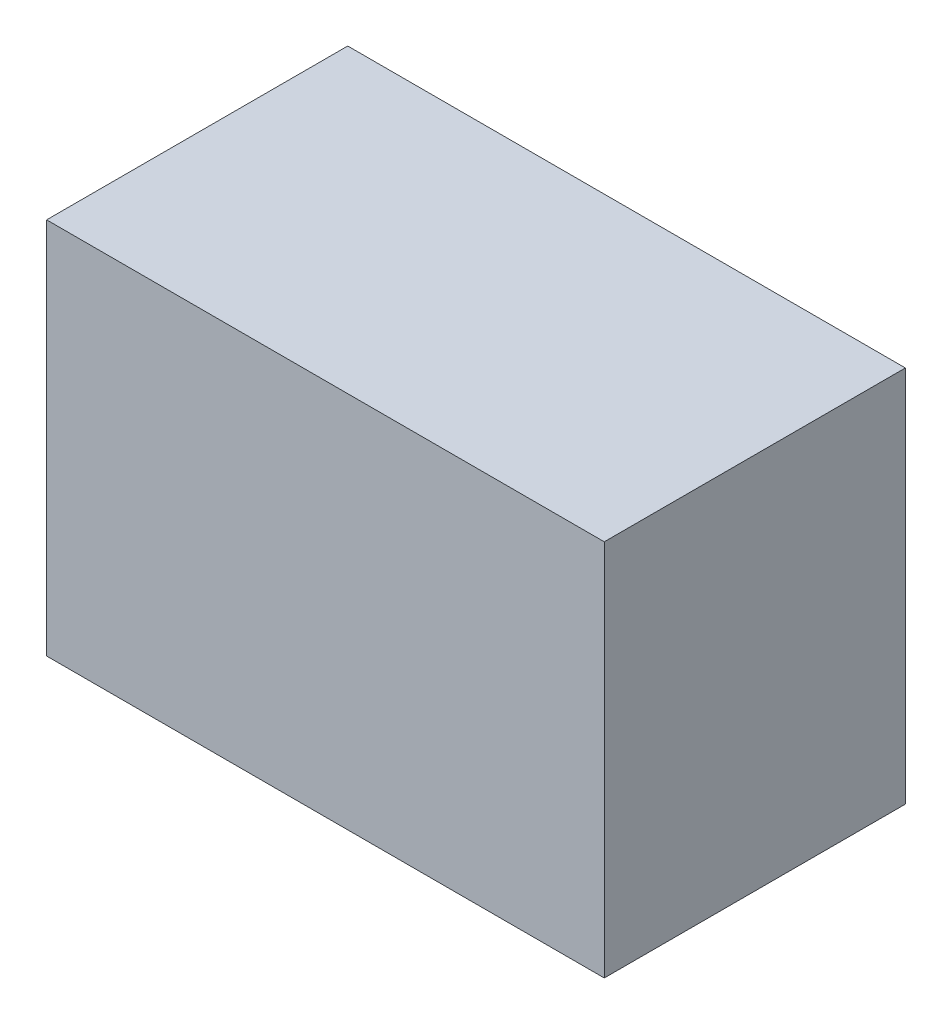
ISO-10303-21;
HEADER;
FILE_DESCRIPTION(('STEP AP214'),'2;1');
FILE_NAME('part.step','',(''),(''),'','','');
FILE_SCHEMA(('AUTOMOTIVE_DESIGN { 1 0 10303 214 1 1 1 1 }'));
ENDSEC;
DATA;
#1=APPLICATION_CONTEXT('core data for automotive mechanical design processes');
#2=APPLICATION_PROTOCOL_DEFINITION('international standard','automotive_design',2000,#1);
#3=PRODUCT_CONTEXT('',#1,'mechanical');
#4=PRODUCT('Part','Part','',(#3));
#5=PRODUCT_RELATED_PRODUCT_CATEGORY('part','',(#4));
#6=PRODUCT_DEFINITION_FORMATION('','',#4);
#7=PRODUCT_DEFINITION_CONTEXT('part definition',#1,'design');
#8=PRODUCT_DEFINITION('design','',#6,#7);
#9=PRODUCT_DEFINITION_SHAPE('','',#8);
#10=(LENGTH_UNIT() NAMED_UNIT(*) SI_UNIT(.MILLI.,.METRE.));
#11=(NAMED_UNIT(*) PLANE_ANGLE_UNIT() SI_UNIT($,.RADIAN.));
#12=(NAMED_UNIT(*) SI_UNIT($,.STERADIAN.) SOLID_ANGLE_UNIT());
#13=UNCERTAINTY_MEASURE_WITH_UNIT(LENGTH_MEASURE(1.E-05),#10,'distance_accuracy_value','');
#14=(GEOMETRIC_REPRESENTATION_CONTEXT(3) GLOBAL_UNCERTAINTY_ASSIGNED_CONTEXT((#13)) GLOBAL_UNIT_ASSIGNED_CONTEXT((#10,
#11,#12)) REPRESENTATION_CONTEXT('',''));
#15=CARTESIAN_POINT('',(0.,0.,0.));
#16=DIRECTION('',(0.,0.,1.));
#17=DIRECTION('',(1.,0.,0.));
#18=AXIS2_PLACEMENT_3D('',#15,#16,#17);
#19=CARTESIAN_POINT('',(46.3,-31.365,50.));
#20=DIRECTION('',(-1.,0.,0.));
#21=DIRECTION('',(0.,0.,1.));
#22=AXIS2_PLACEMENT_3D('',#19,#20,#21);
#23=PLANE('',#22);
#24=DIRECTION('',(0.,1.,0.));
#25=VECTOR('',#24,1.);
#26=CARTESIAN_POINT('',(46.3,-31.365,0.));
#27=LINE('',#26,#25);
#28=CARTESIAN_POINT('',(46.3,-31.365,0.));
#29=VERTEX_POINT('',#28);
#30=CARTESIAN_POINT('',(46.3,31.365,0.));
#31=VERTEX_POINT('',#30);
#32=EDGE_CURVE('E98',#29,#31,#27,.T.);
#33=ORIENTED_EDGE('',*,*,#32,.T.);
#34=DIRECTION('',(0.,0.,-1.));
#35=VECTOR('',#34,1.);
#36=CARTESIAN_POINT('',(46.3,31.365,50.));
#37=LINE('',#36,#35);
#38=CARTESIAN_POINT('',(46.3,31.365,50.));
#39=VERTEX_POINT('',#38);
#40=EDGE_CURVE('E11',#39,#31,#37,.T.);
#41=ORIENTED_EDGE('',*,*,#40,.F.);
#42=DIRECTION('',(0.,1.,0.));
#43=VECTOR('',#42,1.);
#44=CARTESIAN_POINT('',(46.3,-31.365,50.));
#45=LINE('',#44,#43);
#46=CARTESIAN_POINT('',(46.3,-31.365,50.));
#47=VERTEX_POINT('',#46);
#48=EDGE_CURVE('E86',#47,#39,#45,.T.);
#49=ORIENTED_EDGE('',*,*,#48,.F.);
#50=DIRECTION('',(0.,0.,-1.));
#51=VECTOR('',#50,1.);
#52=CARTESIAN_POINT('',(46.3,-31.365,50.));
#53=LINE('',#52,#51);
#54=EDGE_CURVE('E94',#47,#29,#53,.T.);
#55=ORIENTED_EDGE('',*,*,#54,.T.);
#56=EDGE_LOOP('',(#33,#41,#49,#55));
#57=FACE_BOUND('',#56,.T.);
#58=ADVANCED_FACE('F35',(#57),#23,.F.);
#59=CARTESIAN_POINT('',(-46.3,31.365,50.));
#60=DIRECTION('',(0.,-1.,0.));
#61=DIRECTION('',(0.,0.,-1.));
#62=AXIS2_PLACEMENT_3D('',#59,#60,#61);
#63=PLANE('',#62);
#64=DIRECTION('',(-1.,0.,0.));
#65=VECTOR('',#64,1.);
#66=CARTESIAN_POINT('',(-46.3,31.365,0.));
#67=LINE('',#66,#65);
#68=CARTESIAN_POINT('',(-46.3,31.365,0.));
#69=VERTEX_POINT('',#68);
#70=EDGE_CURVE('E90',#31,#69,#67,.T.);
#71=ORIENTED_EDGE('',*,*,#70,.T.);
#72=DIRECTION('',(0.,0.,-1.));
#73=VECTOR('',#72,1.);
#74=CARTESIAN_POINT('',(-46.3,31.365,50.));
#75=LINE('',#74,#73);
#76=CARTESIAN_POINT('',(-46.3,31.365,50.));
#77=VERTEX_POINT('',#76);
#78=EDGE_CURVE('E43',#77,#69,#75,.T.);
#79=ORIENTED_EDGE('',*,*,#78,.F.);
#80=DIRECTION('',(-1.,0.,0.));
#81=VECTOR('',#80,1.);
#82=CARTESIAN_POINT('',(-46.3,31.365,50.));
#83=LINE('',#82,#81);
#84=EDGE_CURVE('E81',#39,#77,#83,.T.);
#85=ORIENTED_EDGE('',*,*,#84,.F.);
#86=ORIENTED_EDGE('',*,*,#40,.T.);
#87=EDGE_LOOP('',(#71,#79,#85,#86));
#88=FACE_BOUND('',#87,.T.);
#89=ADVANCED_FACE('F89',(#88),#63,.F.);
#90=CARTESIAN_POINT('',(-46.3,-31.365,50.));
#91=DIRECTION('',(1.,0.,0.));
#92=DIRECTION('',(0.,0.,-1.));
#93=AXIS2_PLACEMENT_3D('',#90,#91,#92);
#94=PLANE('',#93);
#95=DIRECTION('',(0.,-1.,0.));
#96=VECTOR('',#95,1.);
#97=CARTESIAN_POINT('',(-46.3,-31.365,0.));
#98=LINE('',#97,#96);
#99=CARTESIAN_POINT('',(-46.3,-31.365,0.));
#100=VERTEX_POINT('',#99);
#101=EDGE_CURVE('E68',#69,#100,#98,.T.);
#102=ORIENTED_EDGE('',*,*,#101,.T.);
#103=DIRECTION('',(0.,0.,-1.));
#104=VECTOR('',#103,1.);
#105=CARTESIAN_POINT('',(-46.3,-31.365,50.));
#106=LINE('',#105,#104);
#107=CARTESIAN_POINT('',(-46.3,-31.365,50.));
#108=VERTEX_POINT('',#107);
#109=EDGE_CURVE('E91',#108,#100,#106,.T.);
#110=ORIENTED_EDGE('',*,*,#109,.F.);
#111=DIRECTION('',(0.,-1.,0.));
#112=VECTOR('',#111,1.);
#113=CARTESIAN_POINT('',(-46.3,-31.365,50.));
#114=LINE('',#113,#112);
#115=EDGE_CURVE('E84',#77,#108,#114,.T.);
#116=ORIENTED_EDGE('',*,*,#115,.F.);
#117=ORIENTED_EDGE('',*,*,#78,.T.);
#118=EDGE_LOOP('',(#102,#110,#116,#117));
#119=FACE_BOUND('',#118,.T.);
#120=ADVANCED_FACE('F92',(#119),#94,.F.);
#121=CARTESIAN_POINT('',(-46.3,-31.365,50.));
#122=DIRECTION('',(0.,1.,0.));
#123=DIRECTION('',(0.,0.,1.));
#124=AXIS2_PLACEMENT_3D('',#121,#122,#123);
#125=PLANE('',#124);
#126=DIRECTION('',(1.,0.,0.));
#127=VECTOR('',#126,1.);
#128=CARTESIAN_POINT('',(-46.3,-31.365,0.));
#129=LINE('',#128,#127);
#130=EDGE_CURVE('E74',#100,#29,#129,.T.);
#131=ORIENTED_EDGE('',*,*,#130,.T.);
#132=ORIENTED_EDGE('',*,*,#54,.F.);
#133=DIRECTION('',(1.,0.,0.));
#134=VECTOR('',#133,1.);
#135=CARTESIAN_POINT('',(-46.3,-31.365,50.));
#136=LINE('',#135,#134);
#137=EDGE_CURVE('E51',#108,#47,#136,.T.);
#138=ORIENTED_EDGE('',*,*,#137,.F.);
#139=ORIENTED_EDGE('',*,*,#109,.T.);
#140=EDGE_LOOP('',(#131,#132,#138,#139));
#141=FACE_BOUND('',#140,.T.);
#142=ADVANCED_FACE('F105',(#141),#125,.F.);
#143=CARTESIAN_POINT('',(0.,0.,50.));
#144=DIRECTION('',(0.,0.,-1.));
#145=DIRECTION('',(-1.,0.,0.));
#146=AXIS2_PLACEMENT_3D('',#143,#144,#145);
#147=PLANE('',#146);
#148=ORIENTED_EDGE('',*,*,#48,.T.);
#149=ORIENTED_EDGE('',*,*,#84,.T.);
#150=ORIENTED_EDGE('',*,*,#115,.T.);
#151=ORIENTED_EDGE('',*,*,#137,.T.);
#152=EDGE_LOOP('',(#148,#149,#150,#151));
#153=FACE_BOUND('',#152,.T.);
#154=ADVANCED_FACE('F82',(#153),#147,.F.);
#155=CARTESIAN_POINT('',(0.,0.,0.));
#156=DIRECTION('',(0.,0.,-1.));
#157=DIRECTION('',(-1.,0.,0.));
#158=AXIS2_PLACEMENT_3D('',#155,#156,#157);
#159=PLANE('',#158);
#160=ORIENTED_EDGE('',*,*,#32,.F.);
#161=ORIENTED_EDGE('',*,*,#130,.F.);
#162=ORIENTED_EDGE('',*,*,#101,.F.);
#163=ORIENTED_EDGE('',*,*,#70,.F.);
#164=EDGE_LOOP('',(#160,#161,#162,#163));
#165=FACE_BOUND('',#164,.T.);
#166=ADVANCED_FACE('F108',(#165),#159,.T.);
#167=CLOSED_SHELL('',(#58,#89,#120,#142,#154,#166));
#168=MANIFOLD_SOLID_BREP('B2',#167);
#169=ADVANCED_BREP_SHAPE_REPRESENTATION('',(#18,#168),#14);
#170=SHAPE_DEFINITION_REPRESENTATION(#9,#169);
ENDSEC;
END-ISO-10303-21;
